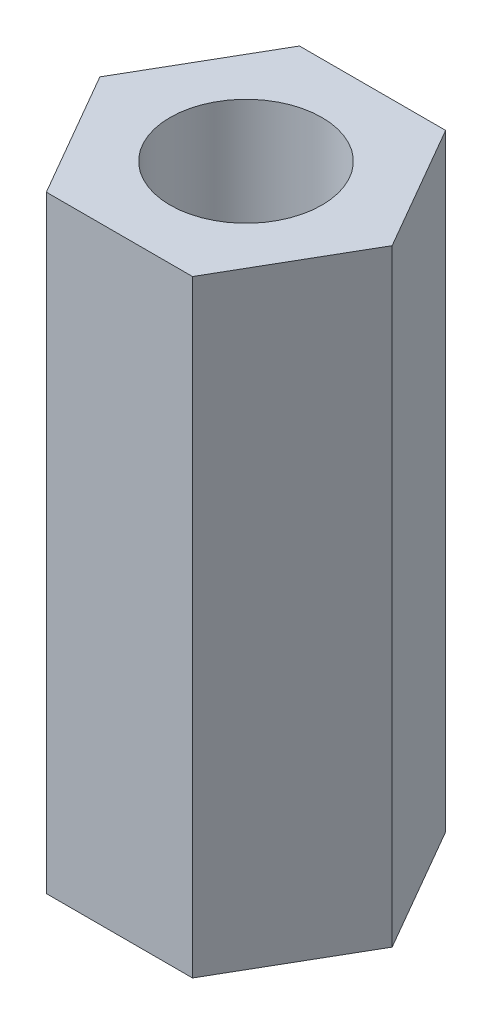
ISO-10303-21;
HEADER;
FILE_DESCRIPTION(('STEP AP214'),'2;1');
FILE_NAME('part.step','',(''),(''),'','','');
FILE_SCHEMA(('AUTOMOTIVE_DESIGN { 1 0 10303 214 1 1 1 1 }'));
ENDSEC;
DATA;
#1=APPLICATION_CONTEXT('core data for automotive mechanical design processes');
#2=APPLICATION_PROTOCOL_DEFINITION('international standard','automotive_design',2000,#1);
#3=PRODUCT_CONTEXT('',#1,'mechanical');
#4=PRODUCT('Part','Part','',(#3));
#5=PRODUCT_RELATED_PRODUCT_CATEGORY('part','',(#4));
#6=PRODUCT_DEFINITION_FORMATION('','',#4);
#7=PRODUCT_DEFINITION_CONTEXT('part definition',#1,'design');
#8=PRODUCT_DEFINITION('design','',#6,#7);
#9=PRODUCT_DEFINITION_SHAPE('','',#8);
#10=(LENGTH_UNIT() NAMED_UNIT(*) SI_UNIT(.MILLI.,.METRE.));
#11=(NAMED_UNIT(*) PLANE_ANGLE_UNIT() SI_UNIT($,.RADIAN.));
#12=(NAMED_UNIT(*) SI_UNIT($,.STERADIAN.) SOLID_ANGLE_UNIT());
#13=UNCERTAINTY_MEASURE_WITH_UNIT(LENGTH_MEASURE(1.E-05),#10,'distance_accuracy_value','');
#14=(GEOMETRIC_REPRESENTATION_CONTEXT(3) GLOBAL_UNCERTAINTY_ASSIGNED_CONTEXT((#13)) GLOBAL_UNIT_ASSIGNED_CONTEXT((#10,
#11,#12)) REPRESENTATION_CONTEXT('',''));
#15=CARTESIAN_POINT('',(0.,0.,0.));
#16=DIRECTION('',(0.,0.,1.));
#17=DIRECTION('',(1.,0.,0.));
#18=AXIS2_PLACEMENT_3D('',#15,#16,#17);
#19=CARTESIAN_POINT('',(0.,12.,0.));
#20=DIRECTION('',(0.,-1.,0.));
#21=DIRECTION('',(0.,0.,-1.));
#22=AXIS2_PLACEMENT_3D('',#19,#20,#21);
#23=PLANE('',#22);
#24=DIRECTION('',(-1.,0.,0.));
#25=VECTOR('',#24,1.);
#26=CARTESIAN_POINT('',(-1.4435,12.,-2.50021534072567));
#27=LINE('',#26,#25);
#28=CARTESIAN_POINT('',(1.4435,12.,-2.50021534072567));
#29=VERTEX_POINT('',#28);
#30=CARTESIAN_POINT('',(-1.4435,12.,-2.50021534072567));
#31=VERTEX_POINT('',#30);
#32=EDGE_CURVE('E129',#29,#31,#27,.T.);
#33=ORIENTED_EDGE('',*,*,#32,.T.);
#34=DIRECTION('',(-0.5,0.,0.866025403784439));
#35=VECTOR('',#34,1.);
#36=CARTESIAN_POINT('',(-2.887,12.,0.));
#37=LINE('',#36,#35);
#38=CARTESIAN_POINT('',(-2.887,12.,0.));
#39=VERTEX_POINT('',#38);
#40=EDGE_CURVE('E87',#31,#39,#37,.T.);
#41=ORIENTED_EDGE('',*,*,#40,.T.);
#42=DIRECTION('',(0.499999999999999,0.,0.866025403784439));
#43=VECTOR('',#42,1.);
#44=CARTESIAN_POINT('',(-1.4435,12.,2.50021534072567));
#45=LINE('',#44,#43);
#46=CARTESIAN_POINT('',(-1.4435,12.,2.50021534072567));
#47=VERTEX_POINT('',#46);
#48=EDGE_CURVE('E100',#39,#47,#45,.T.);
#49=ORIENTED_EDGE('',*,*,#48,.T.);
#50=DIRECTION('',(1.,0.,0.));
#51=VECTOR('',#50,1.);
#52=CARTESIAN_POINT('',(1.4435,12.,2.50021534072567));
#53=LINE('',#52,#51);
#54=CARTESIAN_POINT('',(1.4435,12.,2.50021534072567));
#55=VERTEX_POINT('',#54);
#56=EDGE_CURVE('E94',#47,#55,#53,.T.);
#57=ORIENTED_EDGE('',*,*,#56,.T.);
#58=DIRECTION('',(0.499999999999999,0.,-0.866025403784439));
#59=VECTOR('',#58,1.);
#60=CARTESIAN_POINT('',(2.887,12.,0.));
#61=LINE('',#60,#59);
#62=CARTESIAN_POINT('',(2.887,12.,0.));
#63=VERTEX_POINT('',#62);
#64=EDGE_CURVE('E98',#55,#63,#61,.T.);
#65=ORIENTED_EDGE('',*,*,#64,.T.);
#66=DIRECTION('',(-0.5,0.,-0.866025403784439));
#67=VECTOR('',#66,1.);
#68=CARTESIAN_POINT('',(1.4435,12.,-2.50021534072567));
#69=LINE('',#68,#67);
#70=EDGE_CURVE('E50',#63,#29,#69,.T.);
#71=ORIENTED_EDGE('',*,*,#70,.T.);
#72=EDGE_LOOP('',(#33,#41,#49,#57,#65,#71));
#73=FACE_BOUND('',#72,.T.);
#74=CARTESIAN_POINT('',(0.,12.,0.));
#75=DIRECTION('',(0.,1.,0.));
#76=DIRECTION('',(0.,0.,1.));
#77=AXIS2_PLACEMENT_3D('',#74,#75,#76);
#78=CIRCLE('',#77,1.5);
#79=CARTESIAN_POINT('',(0.,12.,1.5));
#80=VERTEX_POINT('',#79);
#81=EDGE_CURVE('E122',#80,#80,#78,.T.);
#82=ORIENTED_EDGE('',*,*,#81,.F.);
#83=EDGE_LOOP('',(#82));
#84=FACE_BOUND('',#83,.T.);
#85=ADVANCED_FACE('F33',(#73,#84),#23,.F.);
#86=CARTESIAN_POINT('',(0.,0.,0.));
#87=DIRECTION('',(0.,-1.,0.));
#88=DIRECTION('',(0.,0.,-1.));
#89=AXIS2_PLACEMENT_3D('',#86,#87,#88);
#90=PLANE('',#89);
#91=DIRECTION('',(-1.,0.,0.));
#92=VECTOR('',#91,1.);
#93=CARTESIAN_POINT('',(-1.4435,0.,-2.50021534072567));
#94=LINE('',#93,#92);
#95=CARTESIAN_POINT('',(1.4435,0.,-2.50021534072567));
#96=VERTEX_POINT('',#95);
#97=CARTESIAN_POINT('',(-1.4435,0.,-2.50021534072567));
#98=VERTEX_POINT('',#97);
#99=EDGE_CURVE('E118',#96,#98,#94,.T.);
#100=ORIENTED_EDGE('',*,*,#99,.F.);
#101=DIRECTION('',(-0.5,0.,-0.866025403784439));
#102=VECTOR('',#101,1.);
#103=CARTESIAN_POINT('',(1.4435,0.,-2.50021534072567));
#104=LINE('',#103,#102);
#105=CARTESIAN_POINT('',(2.887,0.,0.));
#106=VERTEX_POINT('',#105);
#107=EDGE_CURVE('E79',#106,#96,#104,.T.);
#108=ORIENTED_EDGE('',*,*,#107,.F.);
#109=DIRECTION('',(0.499999999999999,0.,-0.866025403784439));
#110=VECTOR('',#109,1.);
#111=CARTESIAN_POINT('',(2.887,0.,0.));
#112=LINE('',#111,#110);
#113=CARTESIAN_POINT('',(1.4435,0.,2.50021534072567));
#114=VERTEX_POINT('',#113);
#115=EDGE_CURVE('E73',#114,#106,#112,.T.);
#116=ORIENTED_EDGE('',*,*,#115,.F.);
#117=DIRECTION('',(1.,0.,0.));
#118=VECTOR('',#117,1.);
#119=CARTESIAN_POINT('',(1.4435,0.,2.50021534072567));
#120=LINE('',#119,#118);
#121=CARTESIAN_POINT('',(-1.4435,0.,2.50021534072567));
#122=VERTEX_POINT('',#121);
#123=EDGE_CURVE('E108',#122,#114,#120,.T.);
#124=ORIENTED_EDGE('',*,*,#123,.F.);
#125=DIRECTION('',(0.499999999999999,0.,0.866025403784439));
#126=VECTOR('',#125,1.);
#127=CARTESIAN_POINT('',(-1.4435,0.,2.50021534072567));
#128=LINE('',#127,#126);
#129=CARTESIAN_POINT('',(-2.887,0.,0.));
#130=VERTEX_POINT('',#129);
#131=EDGE_CURVE('E124',#130,#122,#128,.T.);
#132=ORIENTED_EDGE('',*,*,#131,.F.);
#133=DIRECTION('',(-0.5,0.,0.866025403784439));
#134=VECTOR('',#133,1.);
#135=CARTESIAN_POINT('',(-2.887,0.,0.));
#136=LINE('',#135,#134);
#137=EDGE_CURVE('E121',#98,#130,#136,.T.);
#138=ORIENTED_EDGE('',*,*,#137,.F.);
#139=EDGE_LOOP('',(#100,#108,#116,#124,#132,#138));
#140=FACE_BOUND('',#139,.T.);
#141=CARTESIAN_POINT('',(0.,0.,0.));
#142=DIRECTION('',(0.,1.,0.));
#143=DIRECTION('',(0.,0.,1.));
#144=AXIS2_PLACEMENT_3D('',#141,#142,#143);
#145=CIRCLE('',#144,1.5);
#146=CARTESIAN_POINT('',(0.,0.,1.5));
#147=VERTEX_POINT('',#146);
#148=EDGE_CURVE('E222',#147,#147,#145,.T.);
#149=ORIENTED_EDGE('',*,*,#148,.T.);
#150=EDGE_LOOP('',(#149));
#151=FACE_BOUND('',#150,.T.);
#152=ADVANCED_FACE('F138',(#140,#151),#90,.T.);
#153=CARTESIAN_POINT('',(-1.4435,12.,-2.50021534072567));
#154=DIRECTION('',(0.,0.,1.));
#155=DIRECTION('',(1.,0.,0.));
#156=AXIS2_PLACEMENT_3D('',#153,#154,#155);
#157=PLANE('',#156);
#158=ORIENTED_EDGE('',*,*,#99,.T.);
#159=DIRECTION('',(0.,-1.,0.));
#160=VECTOR('',#159,1.);
#161=CARTESIAN_POINT('',(-1.4435,12.,-2.50021534072567));
#162=LINE('',#161,#160);
#163=EDGE_CURVE('E11',#31,#98,#162,.T.);
#164=ORIENTED_EDGE('',*,*,#163,.F.);
#165=ORIENTED_EDGE('',*,*,#32,.F.);
#166=DIRECTION('',(0.,-1.,0.));
#167=VECTOR('',#166,1.);
#168=CARTESIAN_POINT('',(1.4435,12.,-2.50021534072567));
#169=LINE('',#168,#167);
#170=EDGE_CURVE('E114',#29,#96,#169,.T.);
#171=ORIENTED_EDGE('',*,*,#170,.T.);
#172=EDGE_LOOP('',(#158,#164,#165,#171));
#173=FACE_BOUND('',#172,.T.);
#174=ADVANCED_FACE('F35',(#173),#157,.F.);
#175=CARTESIAN_POINT('',(-2.887,12.,0.));
#176=DIRECTION('',(0.866025403784439,0.,0.5));
#177=DIRECTION('',(0.5,0.,-0.866025403784439));
#178=AXIS2_PLACEMENT_3D('',#175,#176,#177);
#179=PLANE('',#178);
#180=ORIENTED_EDGE('',*,*,#137,.T.);
#181=DIRECTION('',(0.,-1.,0.));
#182=VECTOR('',#181,1.);
#183=CARTESIAN_POINT('',(-2.887,12.,0.));
#184=LINE('',#183,#182);
#185=EDGE_CURVE('E42',#39,#130,#184,.T.);
#186=ORIENTED_EDGE('',*,*,#185,.F.);
#187=ORIENTED_EDGE('',*,*,#40,.F.);
#188=ORIENTED_EDGE('',*,*,#163,.T.);
#189=EDGE_LOOP('',(#180,#186,#187,#188));
#190=FACE_BOUND('',#189,.T.);
#191=ADVANCED_FACE('F163',(#190),#179,.F.);
#192=CARTESIAN_POINT('',(-1.4435,12.,2.50021534072567));
#193=DIRECTION('',(0.866025403784439,0.,-0.5));
#194=DIRECTION('',(-0.5,0.,-0.866025403784439));
#195=AXIS2_PLACEMENT_3D('',#192,#193,#194);
#196=PLANE('',#195);
#197=ORIENTED_EDGE('',*,*,#131,.T.);
#198=DIRECTION('',(0.,-1.,0.));
#199=VECTOR('',#198,1.);
#200=CARTESIAN_POINT('',(-1.4435,12.,2.50021534072567));
#201=LINE('',#200,#199);
#202=EDGE_CURVE('E109',#47,#122,#201,.T.);
#203=ORIENTED_EDGE('',*,*,#202,.F.);
#204=ORIENTED_EDGE('',*,*,#48,.F.);
#205=ORIENTED_EDGE('',*,*,#185,.T.);
#206=EDGE_LOOP('',(#197,#203,#204,#205));
#207=FACE_BOUND('',#206,.T.);
#208=ADVANCED_FACE('F135',(#207),#196,.F.);
#209=CARTESIAN_POINT('',(1.4435,12.,2.50021534072567));
#210=DIRECTION('',(0.,0.,-1.));
#211=DIRECTION('',(-1.,0.,0.));
#212=AXIS2_PLACEMENT_3D('',#209,#210,#211);
#213=PLANE('',#212);
#214=ORIENTED_EDGE('',*,*,#123,.T.);
#215=DIRECTION('',(0.,-1.,0.));
#216=VECTOR('',#215,1.);
#217=CARTESIAN_POINT('',(1.4435,12.,2.50021534072567));
#218=LINE('',#217,#216);
#219=EDGE_CURVE('E105',#55,#114,#218,.T.);
#220=ORIENTED_EDGE('',*,*,#219,.F.);
#221=ORIENTED_EDGE('',*,*,#56,.F.);
#222=ORIENTED_EDGE('',*,*,#202,.T.);
#223=EDGE_LOOP('',(#214,#220,#221,#222));
#224=FACE_BOUND('',#223,.T.);
#225=ADVANCED_FACE('F106',(#224),#213,.F.);
#226=CARTESIAN_POINT('',(2.887,12.,0.));
#227=DIRECTION('',(-0.866025403784439,0.,-0.5));
#228=DIRECTION('',(-0.5,0.,0.866025403784439));
#229=AXIS2_PLACEMENT_3D('',#226,#227,#228);
#230=PLANE('',#229);
#231=ORIENTED_EDGE('',*,*,#115,.T.);
#232=DIRECTION('',(0.,-1.,0.));
#233=VECTOR('',#232,1.);
#234=CARTESIAN_POINT('',(2.887,12.,0.));
#235=LINE('',#234,#233);
#236=EDGE_CURVE('E110',#63,#106,#235,.T.);
#237=ORIENTED_EDGE('',*,*,#236,.F.);
#238=ORIENTED_EDGE('',*,*,#64,.F.);
#239=ORIENTED_EDGE('',*,*,#219,.T.);
#240=EDGE_LOOP('',(#231,#237,#238,#239));
#241=FACE_BOUND('',#240,.T.);
#242=ADVANCED_FACE('F112',(#241),#230,.F.);
#243=CARTESIAN_POINT('',(1.4435,12.,-2.50021534072567));
#244=DIRECTION('',(-0.866025403784439,0.,0.5));
#245=DIRECTION('',(0.5,0.,0.866025403784439));
#246=AXIS2_PLACEMENT_3D('',#243,#244,#245);
#247=PLANE('',#246);
#248=ORIENTED_EDGE('',*,*,#107,.T.);
#249=ORIENTED_EDGE('',*,*,#170,.F.);
#250=ORIENTED_EDGE('',*,*,#70,.F.);
#251=ORIENTED_EDGE('',*,*,#236,.T.);
#252=EDGE_LOOP('',(#248,#249,#250,#251));
#253=FACE_BOUND('',#252,.T.);
#254=ADVANCED_FACE('F143',(#253),#247,.F.);
#255=CARTESIAN_POINT('',(0.,12.,0.));
#256=DIRECTION('',(0.,-1.,0.));
#257=DIRECTION('',(0.,0.,-1.));
#258=AXIS2_PLACEMENT_3D('',#255,#256,#257);
#259=CYLINDRICAL_SURFACE('',#258,1.5);
#260=ORIENTED_EDGE('',*,*,#81,.T.);
#261=EDGE_LOOP('',(#260));
#262=FACE_BOUND('',#261,.T.);
#263=ORIENTED_EDGE('',*,*,#148,.F.);
#264=EDGE_LOOP('',(#263));
#265=FACE_BOUND('',#264,.T.);
#266=ADVANCED_FACE('F145',(#262,#265),#259,.F.);
#267=CLOSED_SHELL('',(#85,#152,#174,#191,#208,#225,#242,#254,#266));
#268=MANIFOLD_SOLID_BREP('B2',#267);
#269=ADVANCED_BREP_SHAPE_REPRESENTATION('',(#18,#268),#14);
#270=SHAPE_DEFINITION_REPRESENTATION(#9,#269);
ENDSEC;
END-ISO-10303-21;
